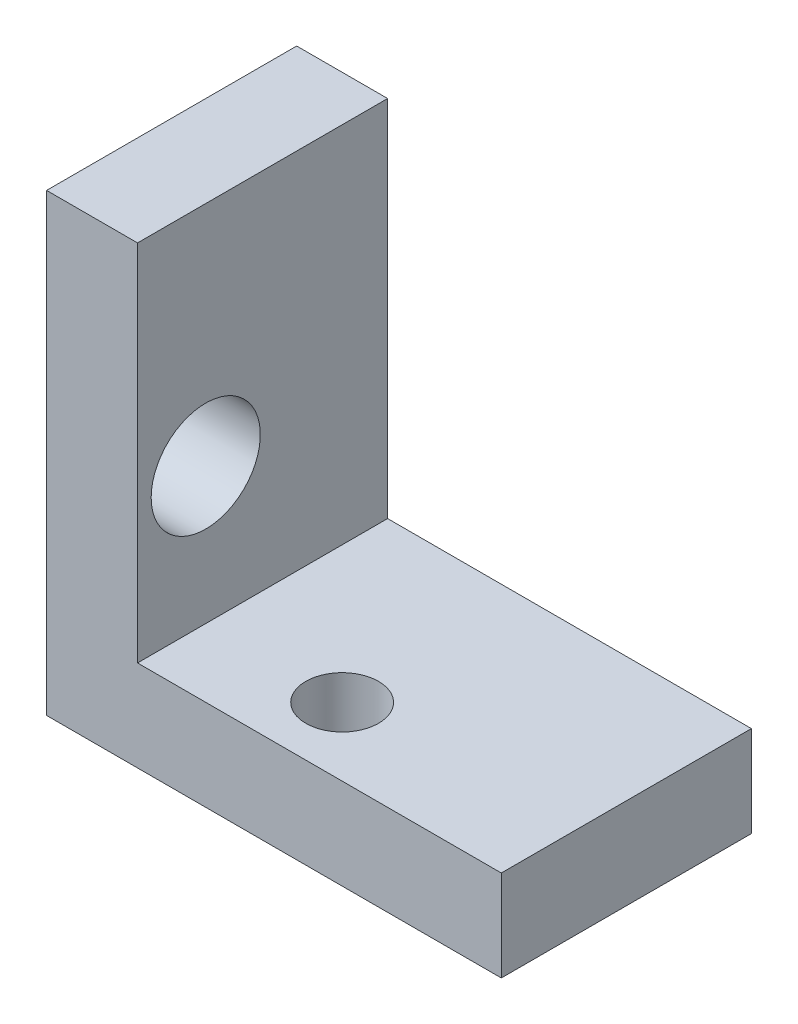
ISO-10303-21;
HEADER;
FILE_DESCRIPTION(('STEP AP214'),'2;1');
FILE_NAME('part.step','',(''),(''),'','','');
FILE_SCHEMA(('AUTOMOTIVE_DESIGN { 1 0 10303 214 1 1 1 1 }'));
ENDSEC;
DATA;
#1=APPLICATION_CONTEXT('core data for automotive mechanical design processes');
#2=APPLICATION_PROTOCOL_DEFINITION('international standard','automotive_design',2000,#1);
#3=PRODUCT_CONTEXT('',#1,'mechanical');
#4=PRODUCT('Part','Part','',(#3));
#5=PRODUCT_RELATED_PRODUCT_CATEGORY('part','',(#4));
#6=PRODUCT_DEFINITION_FORMATION('','',#4);
#7=PRODUCT_DEFINITION_CONTEXT('part definition',#1,'design');
#8=PRODUCT_DEFINITION('design','',#6,#7);
#9=PRODUCT_DEFINITION_SHAPE('','',#8);
#10=(LENGTH_UNIT() NAMED_UNIT(*) SI_UNIT(.MILLI.,.METRE.));
#11=(NAMED_UNIT(*) PLANE_ANGLE_UNIT() SI_UNIT($,.RADIAN.));
#12=(NAMED_UNIT(*) SI_UNIT($,.STERADIAN.) SOLID_ANGLE_UNIT());
#13=UNCERTAINTY_MEASURE_WITH_UNIT(LENGTH_MEASURE(1.E-05),#10,'distance_accuracy_value','');
#14=(GEOMETRIC_REPRESENTATION_CONTEXT(3) GLOBAL_UNCERTAINTY_ASSIGNED_CONTEXT((#13)) GLOBAL_UNIT_ASSIGNED_CONTEXT((#10,
#11,#12)) REPRESENTATION_CONTEXT('',''));
#15=CARTESIAN_POINT('',(0.,0.,0.));
#16=DIRECTION('',(0.,0.,1.));
#17=DIRECTION('',(1.,0.,0.));
#18=AXIS2_PLACEMENT_3D('',#15,#16,#17);
#19=CARTESIAN_POINT('',(10.,0.,5.5));
#20=DIRECTION('',(0.,1.,0.));
#21=DIRECTION('',(-1.,0.,0.));
#22=AXIS2_PLACEMENT_3D('',#19,#20,#21);
#23=PLANE('',#22);
#24=DIRECTION('',(1.,0.,0.));
#25=VECTOR('',#24,1.);
#26=CARTESIAN_POINT('',(10.,0.,0.));
#27=LINE('',#26,#25);
#28=CARTESIAN_POINT('',(0.,0.,0.));
#29=VERTEX_POINT('',#28);
#30=CARTESIAN_POINT('',(10.,0.,0.));
#31=VERTEX_POINT('',#30);
#32=EDGE_CURVE('E127',#29,#31,#27,.T.);
#33=ORIENTED_EDGE('',*,*,#32,.T.);
#34=DIRECTION('',(0.,0.,-1.));
#35=VECTOR('',#34,1.);
#36=CARTESIAN_POINT('',(10.,0.,5.5));
#37=LINE('',#36,#35);
#38=CARTESIAN_POINT('',(10.,0.,5.5));
#39=VERTEX_POINT('',#38);
#40=EDGE_CURVE('E11',#39,#31,#37,.T.);
#41=ORIENTED_EDGE('',*,*,#40,.F.);
#42=DIRECTION('',(1.,0.,0.));
#43=VECTOR('',#42,1.);
#44=CARTESIAN_POINT('',(10.,0.,5.5));
#45=LINE('',#44,#43);
#46=CARTESIAN_POINT('',(0.,0.,5.5));
#47=VERTEX_POINT('',#46);
#48=EDGE_CURVE('E138',#47,#39,#45,.T.);
#49=ORIENTED_EDGE('',*,*,#48,.F.);
#50=DIRECTION('',(0.,0.,-1.));
#51=VECTOR('',#50,1.);
#52=CARTESIAN_POINT('',(0.,0.,5.5));
#53=LINE('',#52,#51);
#54=EDGE_CURVE('E123',#47,#29,#53,.T.);
#55=ORIENTED_EDGE('',*,*,#54,.T.);
#56=EDGE_LOOP('',(#33,#41,#49,#55));
#57=FACE_BOUND('',#56,.T.);
#58=CARTESIAN_POINT('',(5.,0.,4.));
#59=DIRECTION('',(0.,-1.,0.));
#60=DIRECTION('',(0.,0.,-1.));
#61=AXIS2_PLACEMENT_3D('',#58,#59,#60);
#62=CIRCLE('',#61,1.225);
#63=CARTESIAN_POINT('',(5.,0.,2.775));
#64=VERTEX_POINT('',#63);
#65=EDGE_CURVE('E237',#64,#64,#62,.T.);
#66=ORIENTED_EDGE('',*,*,#65,.F.);
#67=EDGE_LOOP('',(#66));
#68=FACE_BOUND('',#67,.T.);
#69=ADVANCED_FACE('F43',(#57,#68),#23,.F.);
#70=CARTESIAN_POINT('',(0.,0.,5.5));
#71=DIRECTION('',(1.,0.,0.));
#72=DIRECTION('',(0.,0.,-1.));
#73=AXIS2_PLACEMENT_3D('',#70,#71,#72);
#74=PLANE('',#73);
#75=DIRECTION('',(0.,-1.,0.));
#76=VECTOR('',#75,1.);
#77=CARTESIAN_POINT('',(0.,0.,0.));
#78=LINE('',#77,#76);
#79=CARTESIAN_POINT('',(0.,10.,0.));
#80=VERTEX_POINT('',#79);
#81=EDGE_CURVE('E88',#80,#29,#78,.T.);
#82=ORIENTED_EDGE('',*,*,#81,.T.);
#83=ORIENTED_EDGE('',*,*,#54,.F.);
#84=DIRECTION('',(0.,-1.,0.));
#85=VECTOR('',#84,1.);
#86=CARTESIAN_POINT('',(0.,0.,5.5));
#87=LINE('',#86,#85);
#88=CARTESIAN_POINT('',(0.,10.,5.5));
#89=VERTEX_POINT('',#88);
#90=EDGE_CURVE('E59',#89,#47,#87,.T.);
#91=ORIENTED_EDGE('',*,*,#90,.F.);
#92=DIRECTION('',(0.,0.,-1.));
#93=VECTOR('',#92,1.);
#94=CARTESIAN_POINT('',(0.,10.,5.5));
#95=LINE('',#94,#93);
#96=EDGE_CURVE('E119',#89,#80,#95,.T.);
#97=ORIENTED_EDGE('',*,*,#96,.T.);
#98=EDGE_LOOP('',(#82,#83,#91,#97));
#99=FACE_BOUND('',#98,.T.);
#100=CARTESIAN_POINT('',(0.,5.,4.));
#101=DIRECTION('',(-1.,0.,0.));
#102=DIRECTION('',(0.,0.,1.));
#103=AXIS2_PLACEMENT_3D('',#100,#101,#102);
#104=CIRCLE('',#103,1.225);
#105=CARTESIAN_POINT('',(0.,5.,5.225));
#106=VERTEX_POINT('',#105);
#107=EDGE_CURVE('E159',#106,#106,#104,.T.);
#108=ORIENTED_EDGE('',*,*,#107,.F.);
#109=EDGE_LOOP('',(#108));
#110=FACE_BOUND('',#109,.T.);
#111=ADVANCED_FACE('F152',(#99,#110),#74,.F.);
#112=CARTESIAN_POINT('',(10.,2.,5.5));
#113=DIRECTION('',(-1.,0.,0.));
#114=DIRECTION('',(0.,-1.,0.));
#115=AXIS2_PLACEMENT_3D('',#112,#113,#114);
#116=PLANE('',#115);
#117=DIRECTION('',(0.,1.,0.));
#118=VECTOR('',#117,1.);
#119=CARTESIAN_POINT('',(10.,2.,0.));
#120=LINE('',#119,#118);
#121=CARTESIAN_POINT('',(10.,2.,0.));
#122=VERTEX_POINT('',#121);
#123=EDGE_CURVE('E130',#31,#122,#120,.T.);
#124=ORIENTED_EDGE('',*,*,#123,.T.);
#125=DIRECTION('',(0.,0.,-1.));
#126=VECTOR('',#125,1.);
#127=CARTESIAN_POINT('',(10.,2.,5.5));
#128=LINE('',#127,#126);
#129=CARTESIAN_POINT('',(10.,2.,5.5));
#130=VERTEX_POINT('',#129);
#131=EDGE_CURVE('E51',#130,#122,#128,.T.);
#132=ORIENTED_EDGE('',*,*,#131,.F.);
#133=DIRECTION('',(0.,1.,0.));
#134=VECTOR('',#133,1.);
#135=CARTESIAN_POINT('',(10.,2.,5.5));
#136=LINE('',#135,#134);
#137=EDGE_CURVE('E96',#39,#130,#136,.T.);
#138=ORIENTED_EDGE('',*,*,#137,.F.);
#139=ORIENTED_EDGE('',*,*,#40,.T.);
#140=EDGE_LOOP('',(#124,#132,#138,#139));
#141=FACE_BOUND('',#140,.T.);
#142=ADVANCED_FACE('F155',(#141),#116,.F.);
#143=CARTESIAN_POINT('',(2.,2.,5.5));
#144=DIRECTION('',(0.,-1.,0.));
#145=DIRECTION('',(0.,0.,-1.));
#146=AXIS2_PLACEMENT_3D('',#143,#144,#145);
#147=PLANE('',#146);
#148=CARTESIAN_POINT('',(5.,2.,4.));
#149=DIRECTION('',(0.,-1.,0.));
#150=DIRECTION('',(0.,0.,-1.));
#151=AXIS2_PLACEMENT_3D('',#148,#149,#150);
#152=CIRCLE('',#151,0.799999999999999);
#153=CARTESIAN_POINT('',(5.,2.,3.2));
#154=VERTEX_POINT('',#153);
#155=EDGE_CURVE('E162',#154,#154,#152,.T.);
#156=ORIENTED_EDGE('',*,*,#155,.T.);
#157=EDGE_LOOP('',(#156));
#158=FACE_BOUND('',#157,.T.);
#159=DIRECTION('',(-1.,0.,0.));
#160=VECTOR('',#159,1.);
#161=CARTESIAN_POINT('',(2.,2.,0.));
#162=LINE('',#161,#160);
#163=CARTESIAN_POINT('',(2.,2.,0.));
#164=VERTEX_POINT('',#163);
#165=EDGE_CURVE('E133',#122,#164,#162,.T.);
#166=ORIENTED_EDGE('',*,*,#165,.T.);
#167=DIRECTION('',(0.,0.,-1.));
#168=VECTOR('',#167,1.);
#169=CARTESIAN_POINT('',(2.,2.,5.5));
#170=LINE('',#169,#168);
#171=CARTESIAN_POINT('',(2.,2.,5.5));
#172=VERTEX_POINT('',#171);
#173=EDGE_CURVE('E118',#172,#164,#170,.T.);
#174=ORIENTED_EDGE('',*,*,#173,.F.);
#175=DIRECTION('',(-1.,0.,0.));
#176=VECTOR('',#175,1.);
#177=CARTESIAN_POINT('',(2.,2.,5.5));
#178=LINE('',#177,#176);
#179=EDGE_CURVE('E109',#130,#172,#178,.T.);
#180=ORIENTED_EDGE('',*,*,#179,.F.);
#181=ORIENTED_EDGE('',*,*,#131,.T.);
#182=EDGE_LOOP('',(#166,#174,#180,#181));
#183=FACE_BOUND('',#182,.T.);
#184=ADVANCED_FACE('F144',(#158,#183),#147,.F.);
#185=CARTESIAN_POINT('',(2.,10.,5.5));
#186=DIRECTION('',(-1.,0.,0.));
#187=DIRECTION('',(0.,0.,1.));
#188=AXIS2_PLACEMENT_3D('',#185,#186,#187);
#189=PLANE('',#188);
#190=CARTESIAN_POINT('',(2.,5.,4.));
#191=DIRECTION('',(-1.,0.,0.));
#192=DIRECTION('',(0.,0.,1.));
#193=AXIS2_PLACEMENT_3D('',#190,#191,#192);
#194=CIRCLE('',#193,1.2);
#195=CARTESIAN_POINT('',(2.,5.,5.2));
#196=VERTEX_POINT('',#195);
#197=EDGE_CURVE('E131',#196,#196,#194,.T.);
#198=ORIENTED_EDGE('',*,*,#197,.T.);
#199=EDGE_LOOP('',(#198));
#200=FACE_BOUND('',#199,.T.);
#201=DIRECTION('',(0.,1.,0.));
#202=VECTOR('',#201,1.);
#203=CARTESIAN_POINT('',(2.,10.,0.));
#204=LINE('',#203,#202);
#205=CARTESIAN_POINT('',(2.,10.,0.));
#206=VERTEX_POINT('',#205);
#207=EDGE_CURVE('E117',#164,#206,#204,.T.);
#208=ORIENTED_EDGE('',*,*,#207,.T.);
#209=DIRECTION('',(0.,0.,-1.));
#210=VECTOR('',#209,1.);
#211=CARTESIAN_POINT('',(2.,10.,5.5));
#212=LINE('',#211,#210);
#213=CARTESIAN_POINT('',(2.,10.,5.5));
#214=VERTEX_POINT('',#213);
#215=EDGE_CURVE('E114',#214,#206,#212,.T.);
#216=ORIENTED_EDGE('',*,*,#215,.F.);
#217=DIRECTION('',(0.,1.,0.));
#218=VECTOR('',#217,1.);
#219=CARTESIAN_POINT('',(2.,10.,5.5));
#220=LINE('',#219,#218);
#221=EDGE_CURVE('E103',#172,#214,#220,.T.);
#222=ORIENTED_EDGE('',*,*,#221,.F.);
#223=ORIENTED_EDGE('',*,*,#173,.T.);
#224=EDGE_LOOP('',(#208,#216,#222,#223));
#225=FACE_BOUND('',#224,.T.);
#226=ADVANCED_FACE('F115',(#200,#225),#189,.F.);
#227=CARTESIAN_POINT('',(0.,10.,5.5));
#228=DIRECTION('',(0.,-1.,0.));
#229=DIRECTION('',(0.,0.,-1.));
#230=AXIS2_PLACEMENT_3D('',#227,#228,#229);
#231=PLANE('',#230);
#232=DIRECTION('',(-1.,0.,0.));
#233=VECTOR('',#232,1.);
#234=CARTESIAN_POINT('',(0.,10.,0.));
#235=LINE('',#234,#233);
#236=EDGE_CURVE('E82',#206,#80,#235,.T.);
#237=ORIENTED_EDGE('',*,*,#236,.T.);
#238=ORIENTED_EDGE('',*,*,#96,.F.);
#239=DIRECTION('',(-1.,0.,0.));
#240=VECTOR('',#239,1.);
#241=CARTESIAN_POINT('',(0.,10.,5.5));
#242=LINE('',#241,#240);
#243=EDGE_CURVE('E107',#214,#89,#242,.T.);
#244=ORIENTED_EDGE('',*,*,#243,.F.);
#245=ORIENTED_EDGE('',*,*,#215,.T.);
#246=EDGE_LOOP('',(#237,#238,#244,#245));
#247=FACE_BOUND('',#246,.T.);
#248=ADVANCED_FACE('F121',(#247),#231,.F.);
#249=CARTESIAN_POINT('',(0.,0.,5.5));
#250=DIRECTION('',(0.,0.,-1.));
#251=DIRECTION('',(-1.,0.,0.));
#252=AXIS2_PLACEMENT_3D('',#249,#250,#251);
#253=PLANE('',#252);
#254=ORIENTED_EDGE('',*,*,#48,.T.);
#255=ORIENTED_EDGE('',*,*,#137,.T.);
#256=ORIENTED_EDGE('',*,*,#179,.T.);
#257=ORIENTED_EDGE('',*,*,#221,.T.);
#258=ORIENTED_EDGE('',*,*,#243,.T.);
#259=ORIENTED_EDGE('',*,*,#90,.T.);
#260=EDGE_LOOP('',(#254,#255,#256,#257,#258,#259));
#261=FACE_BOUND('',#260,.T.);
#262=ADVANCED_FACE('F105',(#261),#253,.F.);
#263=CARTESIAN_POINT('',(0.,0.,0.));
#264=DIRECTION('',(0.,0.,-1.));
#265=DIRECTION('',(-1.,0.,0.));
#266=AXIS2_PLACEMENT_3D('',#263,#264,#265);
#267=PLANE('',#266);
#268=ORIENTED_EDGE('',*,*,#32,.F.);
#269=ORIENTED_EDGE('',*,*,#81,.F.);
#270=ORIENTED_EDGE('',*,*,#236,.F.);
#271=ORIENTED_EDGE('',*,*,#207,.F.);
#272=ORIENTED_EDGE('',*,*,#165,.F.);
#273=ORIENTED_EDGE('',*,*,#123,.F.);
#274=EDGE_LOOP('',(#268,#269,#270,#271,#272,#273));
#275=FACE_BOUND('',#274,.T.);
#276=ADVANCED_FACE('F147',(#275),#267,.T.);
#277=CARTESIAN_POINT('',(0.,5.,4.));
#278=DIRECTION('',(-1.,0.,0.));
#279=DIRECTION('',(0.,0.,1.));
#280=AXIS2_PLACEMENT_3D('',#277,#278,#279);
#281=CYLINDRICAL_SURFACE('',#280,1.2);
#282=ORIENTED_EDGE('',*,*,#197,.F.);
#283=EDGE_LOOP('',(#282));
#284=FACE_BOUND('',#283,.T.);
#285=CARTESIAN_POINT('',(0.0250000000000007,5.,4.));
#286=DIRECTION('',(-1.,0.,0.));
#287=DIRECTION('',(0.,0.,1.));
#288=AXIS2_PLACEMENT_3D('',#285,#286,#287);
#289=CIRCLE('',#288,1.2);
#290=CARTESIAN_POINT('',(0.0250000000000007,5.,5.2));
#291=VERTEX_POINT('',#290);
#292=EDGE_CURVE('E161',#291,#291,#289,.T.);
#293=ORIENTED_EDGE('',*,*,#292,.T.);
#294=EDGE_LOOP('',(#293));
#295=FACE_BOUND('',#294,.T.);
#296=ADVANCED_FACE('F177',(#284,#295),#281,.F.);
#297=CARTESIAN_POINT('',(0.,5.,4.));
#298=DIRECTION('',(-1.,0.,0.));
#299=DIRECTION('',(0.,0.,1.));
#300=AXIS2_PLACEMENT_3D('',#297,#298,#299);
#301=CONICAL_SURFACE('',#300,1.225,0.785398163397466);
#302=ORIENTED_EDGE('',*,*,#292,.F.);
#303=EDGE_LOOP('',(#302));
#304=FACE_BOUND('',#303,.T.);
#305=ORIENTED_EDGE('',*,*,#107,.T.);
#306=EDGE_LOOP('',(#305));
#307=FACE_BOUND('',#306,.T.);
#308=ADVANCED_FACE('F180',(#304,#307),#301,.F.);
#309=CARTESIAN_POINT('',(5.,0.,4.));
#310=DIRECTION('',(0.,-1.,0.));
#311=DIRECTION('',(0.,0.,-1.));
#312=AXIS2_PLACEMENT_3D('',#309,#310,#311);
#313=CYLINDRICAL_SURFACE('',#312,0.799999999999999);
#314=ORIENTED_EDGE('',*,*,#155,.F.);
#315=EDGE_LOOP('',(#314));
#316=FACE_BOUND('',#315,.T.);
#317=CARTESIAN_POINT('',(5.,0.425,4.));
#318=DIRECTION('',(0.,-1.,0.));
#319=DIRECTION('',(0.,0.,-1.));
#320=AXIS2_PLACEMENT_3D('',#317,#318,#319);
#321=CIRCLE('',#320,0.799999999999999);
#322=CARTESIAN_POINT('',(5.,0.425,3.2));
#323=VERTEX_POINT('',#322);
#324=EDGE_CURVE('E167',#323,#323,#321,.T.);
#325=ORIENTED_EDGE('',*,*,#324,.T.);
#326=EDGE_LOOP('',(#325));
#327=FACE_BOUND('',#326,.T.);
#328=ADVANCED_FACE('F185',(#316,#327),#313,.F.);
#329=CARTESIAN_POINT('',(5.,0.,4.));
#330=DIRECTION('',(0.,-1.,0.));
#331=DIRECTION('',(0.,0.,-1.));
#332=AXIS2_PLACEMENT_3D('',#329,#330,#331);
#333=CONICAL_SURFACE('',#332,1.225,0.785398163397447);
#334=ORIENTED_EDGE('',*,*,#324,.F.);
#335=EDGE_LOOP('',(#334));
#336=FACE_BOUND('',#335,.T.);
#337=ORIENTED_EDGE('',*,*,#65,.T.);
#338=EDGE_LOOP('',(#337));
#339=FACE_BOUND('',#338,.T.);
#340=ADVANCED_FACE('F191',(#336,#339),#333,.F.);
#341=CLOSED_SHELL('',(#69,#111,#142,#184,#226,#248,#262,#276,#296,#308,#328,#340));
#342=MANIFOLD_SOLID_BREP('B2',#341);
#343=ADVANCED_BREP_SHAPE_REPRESENTATION('',(#18,#342),#14);
#344=SHAPE_DEFINITION_REPRESENTATION(#9,#343);
ENDSEC;
END-ISO-10303-21;
